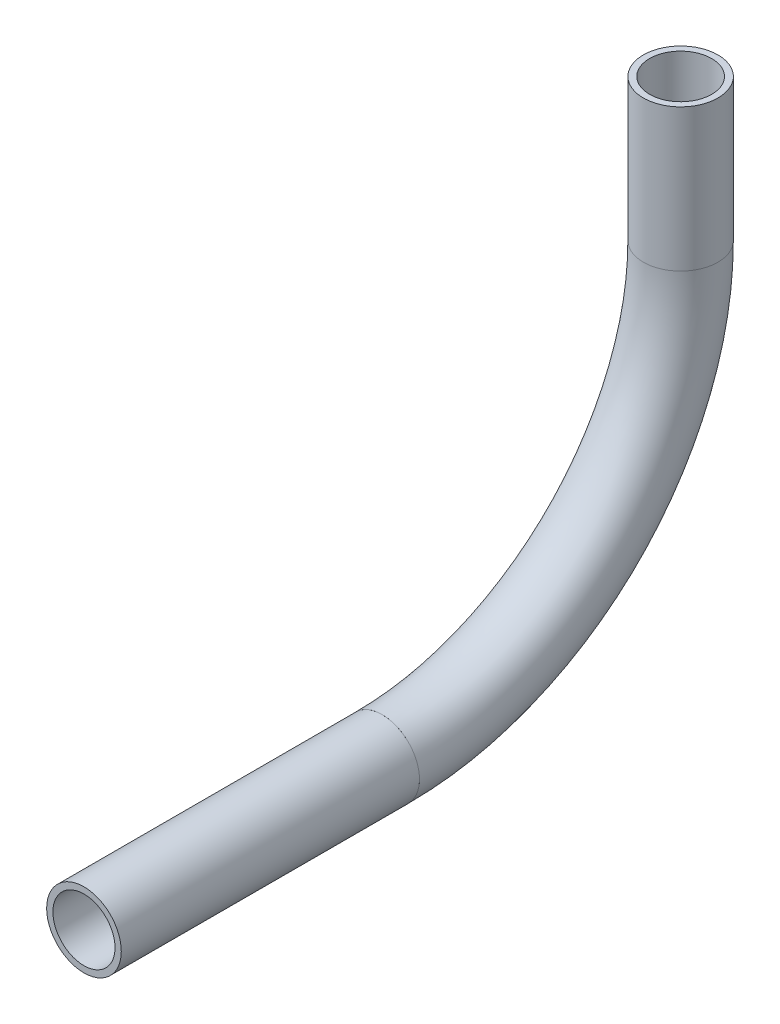
ISO-10303-21;
HEADER;
FILE_DESCRIPTION(('STEP AP214'),'2;1');
FILE_NAME('part.step','',(''),(''),'','','');
FILE_SCHEMA(('AUTOMOTIVE_DESIGN { 1 0 10303 214 1 1 1 1 }'));
ENDSEC;
DATA;
#1=APPLICATION_CONTEXT('core data for automotive mechanical design processes');
#2=APPLICATION_PROTOCOL_DEFINITION('international standard','automotive_design',2000,#1);
#3=PRODUCT_CONTEXT('',#1,'mechanical');
#4=PRODUCT('Part','Part','',(#3));
#5=PRODUCT_RELATED_PRODUCT_CATEGORY('part','',(#4));
#6=PRODUCT_DEFINITION_FORMATION('','',#4);
#7=PRODUCT_DEFINITION_CONTEXT('part definition',#1,'design');
#8=PRODUCT_DEFINITION('design','',#6,#7);
#9=PRODUCT_DEFINITION_SHAPE('','',#8);
#10=(LENGTH_UNIT() NAMED_UNIT(*) SI_UNIT(.MILLI.,.METRE.));
#11=(NAMED_UNIT(*) PLANE_ANGLE_UNIT() SI_UNIT($,.RADIAN.));
#12=(NAMED_UNIT(*) SI_UNIT($,.STERADIAN.) SOLID_ANGLE_UNIT());
#13=UNCERTAINTY_MEASURE_WITH_UNIT(LENGTH_MEASURE(1.E-05),#10,'distance_accuracy_value','');
#14=(GEOMETRIC_REPRESENTATION_CONTEXT(3) GLOBAL_UNCERTAINTY_ASSIGNED_CONTEXT((#13)) GLOBAL_UNIT_ASSIGNED_CONTEXT((#10,
#11,#12)) REPRESENTATION_CONTEXT('',''));
#15=CARTESIAN_POINT('',(0.,0.,0.));
#16=DIRECTION('',(0.,0.,1.));
#17=DIRECTION('',(1.,0.,0.));
#18=AXIS2_PLACEMENT_3D('',#15,#16,#17);
#19=CARTESIAN_POINT('',(0.,-225.780467918474,259.179579455468));
#20=DIRECTION('',(0.,1.,0.));
#21=DIRECTION('',(0.,0.,1.));
#22=AXIS2_PLACEMENT_3D('',#19,#20,#21);
#23=CYLINDRICAL_SURFACE('',#22,5.28319999999999);
#24=CARTESIAN_POINT('',(0.,-201.573709624171,259.179579455468));
#25=DIRECTION('',(0.,-1.,0.));
#26=DIRECTION('',(0.,0.,-1.));
#27=AXIS2_PLACEMENT_3D('',#24,#25,#26);
#28=CIRCLE('',#27,5.28319999999999);
#29=CARTESIAN_POINT('',(0.,-201.573709624171,253.896379455468));
#30=VERTEX_POINT('',#29);
#31=EDGE_CURVE('E55',#30,#30,#28,.T.);
#32=ORIENTED_EDGE('',*,*,#31,.F.);
#33=EDGE_LOOP('',(#32));
#34=FACE_BOUND('',#33,.T.);
#35=CARTESIAN_POINT('',(0.,-225.780467918474,259.179579455468));
#36=DIRECTION('',(0.,-1.,0.));
#37=DIRECTION('',(0.,0.,-1.));
#38=AXIS2_PLACEMENT_3D('',#35,#36,#37);
#39=CIRCLE('',#38,5.28319999999999);
#40=CARTESIAN_POINT('',(0.,-225.780467918474,253.896379455468));
#41=VERTEX_POINT('',#40);
#42=EDGE_CURVE('E51',#41,#41,#39,.T.);
#43=ORIENTED_EDGE('',*,*,#42,.T.);
#44=EDGE_LOOP('',(#43));
#45=FACE_BOUND('',#44,.T.);
#46=ADVANCED_FACE('F47',(#34,#45),#23,.F.);
#47=CARTESIAN_POINT('',(0.,-225.780467918474,259.179579455468));
#48=DIRECTION('',(0.,1.,0.));
#49=DIRECTION('',(0.,0.,1.));
#50=AXIS2_PLACEMENT_3D('',#47,#48,#49);
#51=CYLINDRICAL_SURFACE('',#50,6.35);
#52=CARTESIAN_POINT('',(0.,-201.573709624171,259.179579455468));
#53=DIRECTION('',(0.,-1.,0.));
#54=DIRECTION('',(0.,0.,-1.));
#55=AXIS2_PLACEMENT_3D('',#52,#53,#54);
#56=CIRCLE('',#55,6.35);
#57=CARTESIAN_POINT('',(0.,-201.573709624171,252.829579455468));
#58=VERTEX_POINT('',#57);
#59=EDGE_CURVE('E59',#58,#58,#56,.T.);
#60=ORIENTED_EDGE('',*,*,#59,.T.);
#61=EDGE_LOOP('',(#60));
#62=FACE_BOUND('',#61,.T.);
#63=CARTESIAN_POINT('',(0.,-225.780467918474,259.179579455468));
#64=DIRECTION('',(0.,-1.,0.));
#65=DIRECTION('',(0.,0.,-1.));
#66=AXIS2_PLACEMENT_3D('',#63,#64,#65);
#67=CIRCLE('',#66,6.35);
#68=CARTESIAN_POINT('',(0.,-225.780467918474,252.829579455468));
#69=VERTEX_POINT('',#68);
#70=EDGE_CURVE('E12',#69,#69,#67,.T.);
#71=ORIENTED_EDGE('',*,*,#70,.F.);
#72=EDGE_LOOP('',(#71));
#73=FACE_BOUND('',#72,.T.);
#74=ADVANCED_FACE('F74',(#62,#73),#51,.T.);
#75=CARTESIAN_POINT('',(0.,-201.573709624171,259.179579455468));
#76=DIRECTION('',(0.,-1.,0.));
#77=DIRECTION('',(0.,0.,-1.));
#78=AXIS2_PLACEMENT_3D('',#75,#76,#77);
#79=PLANE('',#78);
#80=ORIENTED_EDGE('',*,*,#31,.T.);
#81=EDGE_LOOP('',(#80));
#82=FACE_BOUND('',#81,.T.);
#83=ORIENTED_EDGE('',*,*,#59,.F.);
#84=EDGE_LOOP('',(#83));
#85=FACE_BOUND('',#84,.T.);
#86=ADVANCED_FACE('F70',(#82,#85),#79,.F.);
#87=CARTESIAN_POINT('',(0.,-225.780467918474,259.179579455468));
#88=DIRECTION('',(0.,-1.,0.));
#89=DIRECTION('',(0.,0.,-1.));
#90=AXIS2_PLACEMENT_3D('',#87,#88,#89);
#91=PLANE('',#90);
#92=ORIENTED_EDGE('',*,*,#42,.F.);
#93=EDGE_LOOP('',(#92));
#94=FACE_BOUND('',#93,.T.);
#95=ORIENTED_EDGE('',*,*,#70,.T.);
#96=EDGE_LOOP('',(#95));
#97=FACE_BOUND('',#96,.T.);
#98=ADVANCED_FACE('F49',(#94,#97),#91,.T.);
#99=CLOSED_SHELL('',(#46,#74,#86,#98));
#100=MANIFOLD_SOLID_BREP('B2',#99);
#101=CARTESIAN_POINT('',(0.,-225.780467918474,309.979579455468));
#102=DIRECTION('',(1.,0.,0.));
#103=DIRECTION('',(0.,0.,-1.));
#104=AXIS2_PLACEMENT_3D('',#101,#102,#103);
#105=TOROIDAL_SURFACE('',#104,50.8,5.28319999999999);
#106=CARTESIAN_POINT('',(0.,-276.580467918474,309.979579455468));
#107=DIRECTION('',(0.,0.,1.));
#108=DIRECTION('',(0.,-1.,0.));
#109=AXIS2_PLACEMENT_3D('',#106,#107,#108);
#110=CIRCLE('',#109,5.28319999999999);
#111=CARTESIAN_POINT('',(0.,-281.863667918474,309.979579455468));
#112=VERTEX_POINT('',#111);
#113=EDGE_CURVE('E150',#112,#112,#110,.T.);
#114=CARTESIAN_POINT('',(0.,-225.780467918474,259.179579455468));
#115=DIRECTION('',(0.,1.,0.));
#116=DIRECTION('',(0.,0.,1.));
#117=AXIS2_PLACEMENT_3D('',#114,#115,#116);
#118=CIRCLE('',#117,5.28319999999999);
#119=CARTESIAN_POINT('',(0.,-225.780467918474,253.896379455468));
#120=VERTEX_POINT('',#119);
#121=EDGE_CURVE('E140',#120,#120,#118,.T.);
#122=CARTESIAN_POINT('',(0.,-225.780467918474,309.979579455468));
#123=DIRECTION('',(1.,0.,0.));
#124=DIRECTION('',(0.,0.,-1.));
#125=AXIS2_PLACEMENT_3D('',#122,#123,#124);
#126=CIRCLE('',#125,56.0831999999999);
#127=EDGE_CURVE('',#112,#120,#126,.T.);
#128=ORIENTED_EDGE('',*,*,#113,.T.);
#129=ORIENTED_EDGE('',*,*,#121,.T.);
#130=ORIENTED_EDGE('',*,*,#127,.T.);
#131=ORIENTED_EDGE('',*,*,#127,.F.);
#132=EDGE_LOOP('',(#128,#130,#129,#131));
#133=FACE_BOUND('',#132,.T.);
#134=ADVANCED_FACE('F136',(#133),#105,.F.);
#135=CARTESIAN_POINT('',(0.,-225.780467918474,309.979579455468));
#136=DIRECTION('',(1.,0.,0.));
#137=DIRECTION('',(0.,0.,-1.));
#138=AXIS2_PLACEMENT_3D('',#135,#136,#137);
#139=TOROIDAL_SURFACE('',#138,50.8,6.35);
#140=CARTESIAN_POINT('',(0.,-276.580467918474,309.979579455468));
#141=DIRECTION('',(0.,0.,1.));
#142=DIRECTION('',(0.,-1.,0.));
#143=AXIS2_PLACEMENT_3D('',#140,#141,#142);
#144=CIRCLE('',#143,6.35);
#145=CARTESIAN_POINT('',(0.,-282.930467918474,309.979579455468));
#146=VERTEX_POINT('',#145);
#147=EDGE_CURVE('E144',#146,#146,#144,.T.);
#148=CARTESIAN_POINT('',(0.,-225.780467918474,259.179579455468));
#149=DIRECTION('',(0.,1.,0.));
#150=DIRECTION('',(0.,0.,1.));
#151=AXIS2_PLACEMENT_3D('',#148,#149,#150);
#152=CIRCLE('',#151,6.35);
#153=CARTESIAN_POINT('',(0.,-225.780467918474,252.829579455468));
#154=VERTEX_POINT('',#153);
#155=EDGE_CURVE('E46',#154,#154,#152,.T.);
#156=CARTESIAN_POINT('',(0.,-225.780467918474,309.979579455468));
#157=DIRECTION('',(1.,0.,0.));
#158=DIRECTION('',(0.,0.,-1.));
#159=AXIS2_PLACEMENT_3D('',#156,#157,#158);
#160=CIRCLE('',#159,57.1499999999999);
#161=EDGE_CURVE('',#146,#154,#160,.T.);
#162=ORIENTED_EDGE('',*,*,#147,.F.);
#163=ORIENTED_EDGE('',*,*,#155,.F.);
#164=ORIENTED_EDGE('',*,*,#161,.T.);
#165=ORIENTED_EDGE('',*,*,#161,.F.);
#166=EDGE_LOOP('',(#162,#164,#163,#165));
#167=FACE_BOUND('',#166,.T.);
#168=ADVANCED_FACE('F163',(#167),#139,.T.);
#169=CARTESIAN_POINT('',(0.,-276.580467918475,309.979579455468));
#170=DIRECTION('',(0.,0.,1.));
#171=DIRECTION('',(0.,-1.,0.));
#172=AXIS2_PLACEMENT_3D('',#169,#170,#171);
#173=PLANE('',#172);
#174=ORIENTED_EDGE('',*,*,#113,.F.);
#175=EDGE_LOOP('',(#174));
#176=FACE_BOUND('',#175,.T.);
#177=ORIENTED_EDGE('',*,*,#147,.T.);
#178=EDGE_LOOP('',(#177));
#179=FACE_BOUND('',#178,.T.);
#180=ADVANCED_FACE('F159',(#176,#179),#173,.T.);
#181=CARTESIAN_POINT('',(0.,-225.780467918474,259.179579455468));
#182=DIRECTION('',(0.,1.,0.));
#183=DIRECTION('',(0.,0.,1.));
#184=AXIS2_PLACEMENT_3D('',#181,#182,#183);
#185=PLANE('',#184);
#186=ORIENTED_EDGE('',*,*,#121,.F.);
#187=EDGE_LOOP('',(#186));
#188=FACE_BOUND('',#187,.T.);
#189=ORIENTED_EDGE('',*,*,#155,.T.);
#190=EDGE_LOOP('',(#189));
#191=FACE_BOUND('',#190,.T.);
#192=ADVANCED_FACE('F138',(#188,#191),#185,.T.);
#193=CLOSED_SHELL('',(#134,#168,#180,#192));
#194=MANIFOLD_SOLID_BREP('B7',#193);
#195=CARTESIAN_POINT('',(0.,-276.580467918475,360.727648374792));
#196=DIRECTION('',(0.,0.,-1.));
#197=DIRECTION('',(0.,1.,0.));
#198=AXIS2_PLACEMENT_3D('',#195,#196,#197);
#199=CYLINDRICAL_SURFACE('',#198,5.28319999999999);
#200=CARTESIAN_POINT('',(0.,-276.580467918475,360.727648374792));
#201=DIRECTION('',(0.,0.,1.));
#202=DIRECTION('',(0.,-1.,0.));
#203=AXIS2_PLACEMENT_3D('',#200,#201,#202);
#204=CIRCLE('',#203,5.28319999999999);
#205=CARTESIAN_POINT('',(0.,-281.863667918475,360.727648374792));
#206=VERTEX_POINT('',#205);
#207=EDGE_CURVE('E234',#206,#206,#204,.T.);
#208=ORIENTED_EDGE('',*,*,#207,.T.);
#209=EDGE_LOOP('',(#208));
#210=FACE_BOUND('',#209,.T.);
#211=CARTESIAN_POINT('',(0.,-276.580467918475,309.979579455468));
#212=DIRECTION('',(0.,0.,-1.));
#213=DIRECTION('',(0.,1.,0.));
#214=AXIS2_PLACEMENT_3D('',#211,#212,#213);
#215=CIRCLE('',#214,5.28319999999999);
#216=CARTESIAN_POINT('',(0.,-271.297267918475,309.979579455468));
#217=VERTEX_POINT('',#216);
#218=EDGE_CURVE('E224',#217,#217,#215,.T.);
#219=ORIENTED_EDGE('',*,*,#218,.T.);
#220=EDGE_LOOP('',(#219));
#221=FACE_BOUND('',#220,.T.);
#222=ADVANCED_FACE('F220',(#210,#221),#199,.F.);
#223=CARTESIAN_POINT('',(0.,-276.580467918475,360.727648374792));
#224=DIRECTION('',(0.,0.,-1.));
#225=DIRECTION('',(0.,1.,0.));
#226=AXIS2_PLACEMENT_3D('',#223,#224,#225);
#227=CYLINDRICAL_SURFACE('',#226,6.35);
#228=CARTESIAN_POINT('',(0.,-276.580467918475,360.727648374792));
#229=DIRECTION('',(0.,0.,1.));
#230=DIRECTION('',(0.,-1.,0.));
#231=AXIS2_PLACEMENT_3D('',#228,#229,#230);
#232=CIRCLE('',#231,6.35);
#233=CARTESIAN_POINT('',(0.,-282.930467918475,360.727648374792));
#234=VERTEX_POINT('',#233);
#235=EDGE_CURVE('E228',#234,#234,#232,.T.);
#236=ORIENTED_EDGE('',*,*,#235,.F.);
#237=EDGE_LOOP('',(#236));
#238=FACE_BOUND('',#237,.T.);
#239=CARTESIAN_POINT('',(0.,-276.580467918475,309.979579455468));
#240=DIRECTION('',(0.,0.,-1.));
#241=DIRECTION('',(0.,1.,0.));
#242=AXIS2_PLACEMENT_3D('',#239,#240,#241);
#243=CIRCLE('',#242,6.35);
#244=CARTESIAN_POINT('',(0.,-270.230467918475,309.979579455468));
#245=VERTEX_POINT('',#244);
#246=EDGE_CURVE('E135',#245,#245,#243,.T.);
#247=ORIENTED_EDGE('',*,*,#246,.F.);
#248=EDGE_LOOP('',(#247));
#249=FACE_BOUND('',#248,.T.);
#250=ADVANCED_FACE('F247',(#238,#249),#227,.T.);
#251=CARTESIAN_POINT('',(0.,-276.580467918475,360.727648374792));
#252=DIRECTION('',(0.,0.,1.));
#253=DIRECTION('',(0.,-1.,0.));
#254=AXIS2_PLACEMENT_3D('',#251,#252,#253);
#255=PLANE('',#254);
#256=ORIENTED_EDGE('',*,*,#207,.F.);
#257=EDGE_LOOP('',(#256));
#258=FACE_BOUND('',#257,.T.);
#259=ORIENTED_EDGE('',*,*,#235,.T.);
#260=EDGE_LOOP('',(#259));
#261=FACE_BOUND('',#260,.T.);
#262=ADVANCED_FACE('F243',(#258,#261),#255,.T.);
#263=CARTESIAN_POINT('',(0.,-276.580467918475,309.979579455468));
#264=DIRECTION('',(0.,0.,-1.));
#265=DIRECTION('',(0.,1.,0.));
#266=AXIS2_PLACEMENT_3D('',#263,#264,#265);
#267=PLANE('',#266);
#268=ORIENTED_EDGE('',*,*,#218,.F.);
#269=EDGE_LOOP('',(#268));
#270=FACE_BOUND('',#269,.T.);
#271=ORIENTED_EDGE('',*,*,#246,.T.);
#272=EDGE_LOOP('',(#271));
#273=FACE_BOUND('',#272,.T.);
#274=ADVANCED_FACE('F222',(#270,#273),#267,.T.);
#275=CLOSED_SHELL('',(#222,#250,#262,#274));
#276=MANIFOLD_SOLID_BREP('B41',#275);
#277=ADVANCED_BREP_SHAPE_REPRESENTATION('',(#18,#100,#194,#276),#14);
#278=SHAPE_DEFINITION_REPRESENTATION(#9,#277);
ENDSEC;
END-ISO-10303-21;
